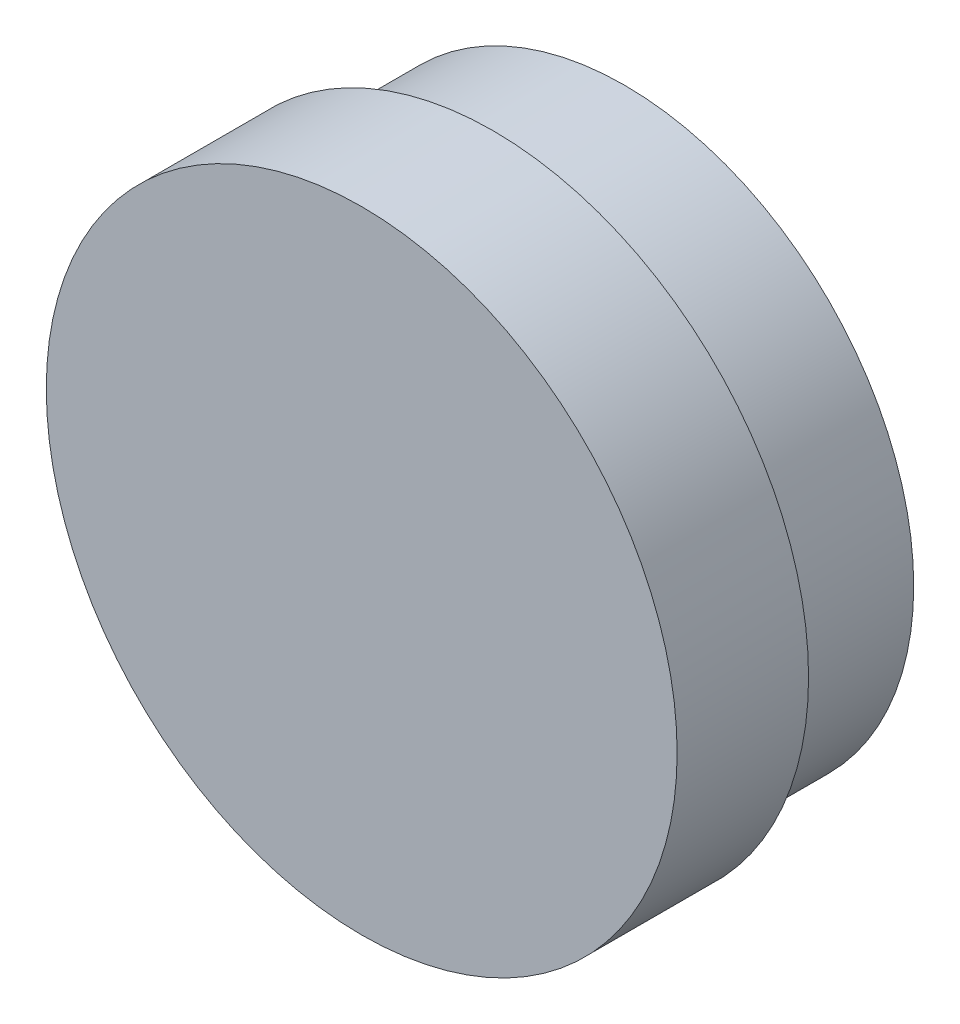
ISO-10303-21;
HEADER;
FILE_DESCRIPTION(('STEP AP214'),'2;1');
FILE_NAME('part.step','',(''),(''),'','','');
FILE_SCHEMA(('AUTOMOTIVE_DESIGN { 1 0 10303 214 1 1 1 1 }'));
ENDSEC;
DATA;
#1=APPLICATION_CONTEXT('core data for automotive mechanical design processes');
#2=APPLICATION_PROTOCOL_DEFINITION('international standard','automotive_design',2000,#1);
#3=PRODUCT_CONTEXT('',#1,'mechanical');
#4=PRODUCT('Part','Part','',(#3));
#5=PRODUCT_RELATED_PRODUCT_CATEGORY('part','',(#4));
#6=PRODUCT_DEFINITION_FORMATION('','',#4);
#7=PRODUCT_DEFINITION_CONTEXT('part definition',#1,'design');
#8=PRODUCT_DEFINITION('design','',#6,#7);
#9=PRODUCT_DEFINITION_SHAPE('','',#8);
#10=(LENGTH_UNIT() NAMED_UNIT(*) SI_UNIT(.MILLI.,.METRE.));
#11=(NAMED_UNIT(*) PLANE_ANGLE_UNIT() SI_UNIT($,.RADIAN.));
#12=(NAMED_UNIT(*) SI_UNIT($,.STERADIAN.) SOLID_ANGLE_UNIT());
#13=UNCERTAINTY_MEASURE_WITH_UNIT(LENGTH_MEASURE(1.E-05),#10,'distance_accuracy_value','');
#14=(GEOMETRIC_REPRESENTATION_CONTEXT(3) GLOBAL_UNCERTAINTY_ASSIGNED_CONTEXT((#13)) GLOBAL_UNIT_ASSIGNED_CONTEXT((#10,
#11,#12)) REPRESENTATION_CONTEXT('',''));
#15=CARTESIAN_POINT('',(0.,0.,0.));
#16=DIRECTION('',(0.,0.,1.));
#17=DIRECTION('',(1.,0.,0.));
#18=AXIS2_PLACEMENT_3D('',#15,#16,#17);
#19=CARTESIAN_POINT('',(1.85019794140934,28.1046296296296,11.9999999999998));
#20=DIRECTION('',(0.,0.,-1.));
#21=DIRECTION('',(-1.,0.,0.));
#22=AXIS2_PLACEMENT_3D('',#19,#20,#21);
#23=CYLINDRICAL_SURFACE('',#22,12.);
#24=CARTESIAN_POINT('',(1.85019794140934,28.1046296296296,16.9999999999998));
#25=DIRECTION('',(0.,0.,1.));
#26=DIRECTION('',(1.,0.,0.));
#27=AXIS2_PLACEMENT_3D('',#24,#25,#26);
#28=CIRCLE('',#27,12.);
#29=CARTESIAN_POINT('',(13.8501979414093,28.1046296296296,16.9999999999998));
#30=VERTEX_POINT('',#29);
#31=EDGE_CURVE('E57',#30,#30,#28,.F.);
#32=ORIENTED_EDGE('',*,*,#31,.F.);
#33=EDGE_LOOP('',(#32));
#34=FACE_BOUND('',#33,.T.);
#35=CARTESIAN_POINT('',(1.85019794140934,28.1046296296296,21.9999999999998));
#36=DIRECTION('',(0.,0.,1.));
#37=DIRECTION('',(1.,0.,0.));
#38=AXIS2_PLACEMENT_3D('',#35,#36,#37);
#39=CIRCLE('',#38,12.);
#40=CARTESIAN_POINT('',(13.8501979414093,28.1046296296296,21.9999999999998));
#41=VERTEX_POINT('',#40);
#42=EDGE_CURVE('E12',#41,#41,#39,.T.);
#43=ORIENTED_EDGE('',*,*,#42,.F.);
#44=EDGE_LOOP('',(#43));
#45=FACE_BOUND('',#44,.T.);
#46=ADVANCED_FACE('F40',(#34,#45),#23,.T.);
#47=CARTESIAN_POINT('',(1.85019794140934,28.1046296296296,21.9999999999998));
#48=DIRECTION('',(0.,0.,1.));
#49=DIRECTION('',(1.,0.,0.));
#50=AXIS2_PLACEMENT_3D('',#47,#48,#49);
#51=PLANE('',#50);
#52=ORIENTED_EDGE('',*,*,#42,.T.);
#53=EDGE_LOOP('',(#52));
#54=FACE_BOUND('',#53,.T.);
#55=ADVANCED_FACE('F69',(#54),#51,.T.);
#56=CARTESIAN_POINT('',(1.85019794140934,28.1046296296296,55.9411254969541));
#57=DIRECTION('',(0.,0.,-1.));
#58=DIRECTION('',(-1.,0.,0.));
#59=AXIS2_PLACEMENT_3D('',#56,#57,#58);
#60=CYLINDRICAL_SURFACE('',#59,11.);
#61=CARTESIAN_POINT('',(1.85019794140934,28.1046296296296,16.9999999999998));
#62=DIRECTION('',(0.,0.,1.));
#63=DIRECTION('',(1.,0.,0.));
#64=AXIS2_PLACEMENT_3D('',#61,#62,#63);
#65=CIRCLE('',#64,11.);
#66=CARTESIAN_POINT('',(-9.14980205859066,28.1046296296296,16.9999999999998));
#67=VERTEX_POINT('',#66);
#68=EDGE_CURVE('E52',#67,#67,#65,.F.);
#69=CARTESIAN_POINT('',(1.85019794140934,28.1046296296296,11.9999999999998));
#70=DIRECTION('',(0.,0.,1.));
#71=DIRECTION('',(1.,0.,0.));
#72=AXIS2_PLACEMENT_3D('',#69,#70,#71);
#73=CIRCLE('',#72,11.);
#74=CARTESIAN_POINT('',(-9.14980205859066,28.1046296296296,11.9999999999998));
#75=VERTEX_POINT('',#74);
#76=EDGE_CURVE('E47',#75,#75,#73,.T.);
#77=CARTESIAN_POINT('',(-9.14980205859066,28.1046296296296,16.9999999999998));
#78=CARTESIAN_POINT('',(-9.14980205859066,28.1046296296296,16.9479166666665));
#79=CARTESIAN_POINT('',(-9.14980205859066,28.1046296296296,16.8958333333331));
#80=CARTESIAN_POINT('',(-9.14980205859066,28.1046296296296,16.7916666666665));
#81=CARTESIAN_POINT('',(-9.14980205859066,28.1046296296296,16.7395833333331));
#82=CARTESIAN_POINT('',(-9.14980205859066,28.1046296296296,16.6354166666665));
#83=CARTESIAN_POINT('',(-9.14980205859066,28.1046296296296,16.5833333333331));
#84=CARTESIAN_POINT('',(-9.14980205859066,28.1046296296296,16.4791666666665));
#85=CARTESIAN_POINT('',(-9.14980205859066,28.1046296296296,16.4270833333331));
#86=CARTESIAN_POINT('',(-9.14980205859066,28.1046296296296,16.3229166666665));
#87=CARTESIAN_POINT('',(-9.14980205859066,28.1046296296296,16.2708333333331));
#88=CARTESIAN_POINT('',(-9.14980205859066,28.1046296296296,16.1666666666665));
#89=CARTESIAN_POINT('',(-9.14980205859066,28.1046296296296,16.1145833333331));
#90=CARTESIAN_POINT('',(-9.14980205859066,28.1046296296296,16.0104166666665));
#91=CARTESIAN_POINT('',(-9.14980205859066,28.1046296296296,15.9583333333331));
#92=CARTESIAN_POINT('',(-9.14980205859066,28.1046296296296,15.8541666666665));
#93=CARTESIAN_POINT('',(-9.14980205859066,28.1046296296296,15.8020833333331));
#94=CARTESIAN_POINT('',(-9.14980205859066,28.1046296296296,15.6979166666665));
#95=CARTESIAN_POINT('',(-9.14980205859066,28.1046296296296,15.6458333333331));
#96=CARTESIAN_POINT('',(-9.14980205859066,28.1046296296296,15.5416666666665));
#97=CARTESIAN_POINT('',(-9.14980205859066,28.1046296296296,15.4895833333331));
#98=CARTESIAN_POINT('',(-9.14980205859066,28.1046296296296,15.3854166666665));
#99=CARTESIAN_POINT('',(-9.14980205859066,28.1046296296296,15.3333333333331));
#100=CARTESIAN_POINT('',(-9.14980205859066,28.1046296296296,15.2291666666665));
#101=CARTESIAN_POINT('',(-9.14980205859066,28.1046296296296,15.1770833333331));
#102=CARTESIAN_POINT('',(-9.14980205859066,28.1046296296296,15.0729166666665));
#103=CARTESIAN_POINT('',(-9.14980205859066,28.1046296296296,15.0208333333331));
#104=CARTESIAN_POINT('',(-9.14980205859066,28.1046296296296,14.9166666666665));
#105=CARTESIAN_POINT('',(-9.14980205859066,28.1046296296296,14.8645833333331));
#106=CARTESIAN_POINT('',(-9.14980205859066,28.1046296296296,14.7604166666665));
#107=CARTESIAN_POINT('',(-9.14980205859066,28.1046296296296,14.7083333333331));
#108=CARTESIAN_POINT('',(-9.14980205859066,28.1046296296296,14.6041666666665));
#109=CARTESIAN_POINT('',(-9.14980205859066,28.1046296296296,14.5520833333331));
#110=CARTESIAN_POINT('',(-9.14980205859066,28.1046296296296,14.4479166666665));
#111=CARTESIAN_POINT('',(-9.14980205859066,28.1046296296296,14.3958333333331));
#112=CARTESIAN_POINT('',(-9.14980205859066,28.1046296296296,14.2916666666665));
#113=CARTESIAN_POINT('',(-9.14980205859066,28.1046296296296,14.2395833333331));
#114=CARTESIAN_POINT('',(-9.14980205859066,28.1046296296296,14.1354166666665));
#115=CARTESIAN_POINT('',(-9.14980205859066,28.1046296296296,14.0833333333331));
#116=CARTESIAN_POINT('',(-9.14980205859066,28.1046296296296,13.9791666666665));
#117=CARTESIAN_POINT('',(-9.14980205859066,28.1046296296296,13.9270833333331));
#118=CARTESIAN_POINT('',(-9.14980205859066,28.1046296296296,13.8229166666665));
#119=CARTESIAN_POINT('',(-9.14980205859066,28.1046296296296,13.7708333333331));
#120=CARTESIAN_POINT('',(-9.14980205859066,28.1046296296296,13.6666666666665));
#121=CARTESIAN_POINT('',(-9.14980205859066,28.1046296296296,13.6145833333331));
#122=CARTESIAN_POINT('',(-9.14980205859066,28.1046296296296,13.5104166666665));
#123=CARTESIAN_POINT('',(-9.14980205859066,28.1046296296296,13.4583333333331));
#124=CARTESIAN_POINT('',(-9.14980205859066,28.1046296296296,13.3541666666665));
#125=CARTESIAN_POINT('',(-9.14980205859066,28.1046296296296,13.3020833333331));
#126=CARTESIAN_POINT('',(-9.14980205859066,28.1046296296296,13.1979166666665));
#127=CARTESIAN_POINT('',(-9.14980205859066,28.1046296296296,13.1458333333331));
#128=CARTESIAN_POINT('',(-9.14980205859066,28.1046296296296,13.0416666666665));
#129=CARTESIAN_POINT('',(-9.14980205859066,28.1046296296296,12.9895833333331));
#130=CARTESIAN_POINT('',(-9.14980205859066,28.1046296296296,12.8854166666665));
#131=CARTESIAN_POINT('',(-9.14980205859066,28.1046296296296,12.8333333333331));
#132=CARTESIAN_POINT('',(-9.14980205859066,28.1046296296296,12.7291666666665));
#133=CARTESIAN_POINT('',(-9.14980205859066,28.1046296296296,12.6770833333331));
#134=CARTESIAN_POINT('',(-9.14980205859066,28.1046296296296,12.5729166666665));
#135=CARTESIAN_POINT('',(-9.14980205859066,28.1046296296296,12.5208333333331));
#136=CARTESIAN_POINT('',(-9.14980205859066,28.1046296296296,12.4166666666665));
#137=CARTESIAN_POINT('',(-9.14980205859066,28.1046296296296,12.3645833333331));
#138=CARTESIAN_POINT('',(-9.14980205859066,28.1046296296296,12.2604166666665));
#139=CARTESIAN_POINT('',(-9.14980205859066,28.1046296296296,12.2083333333331));
#140=CARTESIAN_POINT('',(-9.14980205859066,28.1046296296296,12.1041666666665));
#141=CARTESIAN_POINT('',(-9.14980205859066,28.1046296296296,12.0520833333331));
#142=CARTESIAN_POINT('',(-9.14980205859066,28.1046296296296,11.9999999999998));
#143=B_SPLINE_CURVE_WITH_KNOTS('',3,(#77,#78,#79,#80,#81,#82,#83,#84,#85,#86,#87,#88,#89,#90,
#91,#92,#93,#94,#95,#96,#97,#98,#99,#100,#101,#102,#103,#104,#105,#106,#107,#108,#109,#110,#111,
#112,#113,#114,#115,#116,#117,#118,#119,#120,#121,#122,#123,#124,#125,#126,#127,#128,#129,#130,
#131,#132,#133,#134,#135,#136,#137,#138,#139,#140,#141,#142),.UNSPECIFIED.,.F.,.F.,(4,2,2,2,2,2,
2,2,2,2,2,2,2,2,2,2,2,2,2,2,2,2,2,2,2,2,2,2,2,2,2,2,4),(0.,0.156249999999997,0.3125,
0.468749999999997,0.625000000000001,0.781249999999997,0.937500000000001,1.09375,1.25,1.40625,
1.56249999999999,1.71875,1.87499999999999,2.03125,2.1875,2.34375,2.5,2.65624999999999,2.8125,
2.96874999999999,3.125,3.28124999999999,3.4375,3.59374999999999,3.74999999999999,
3.90624999999999,4.06249999999999,4.21874999999999,4.37499999999999,4.53124999999999,
4.68749999999999,4.84374999999999,4.99999999999999),.UNSPECIFIED.);
#144=EDGE_CURVE('BSEAM73',#67,#75,#143,.T.);
#145=ORIENTED_EDGE('',*,*,#68,.T.);
#146=ORIENTED_EDGE('',*,*,#76,.T.);
#147=ORIENTED_EDGE('',*,*,#144,.T.);
#148=ORIENTED_EDGE('',*,*,#144,.F.);
#149=EDGE_LOOP('',(#145,#147,#146,#148));
#150=FACE_BOUND('',#149,.T.);
#151=ADVANCED_FACE('F73',(#150),#60,.T.);
#152=CARTESIAN_POINT('',(1.85019794140934,28.1046296296296,16.9999999999998));
#153=DIRECTION('',(0.,0.,1.));
#154=DIRECTION('',(1.,0.,0.));
#155=AXIS2_PLACEMENT_3D('',#152,#153,#154);
#156=PLANE('',#155);
#157=ORIENTED_EDGE('',*,*,#31,.T.);
#158=EDGE_LOOP('',(#157));
#159=FACE_BOUND('',#158,.T.);
#160=ORIENTED_EDGE('',*,*,#68,.F.);
#161=EDGE_LOOP('',(#160));
#162=FACE_BOUND('',#161,.T.);
#163=ADVANCED_FACE('F64',(#159,#162),#156,.F.);
#164=CARTESIAN_POINT('',(1.85019794140934,28.1046296296296,11.9999999999998));
#165=DIRECTION('',(0.,0.,1.));
#166=DIRECTION('',(1.,0.,0.));
#167=AXIS2_PLACEMENT_3D('',#164,#165,#166);
#168=PLANE('',#167);
#169=ORIENTED_EDGE('',*,*,#76,.F.);
#170=EDGE_LOOP('',(#169));
#171=FACE_BOUND('',#170,.T.);
#172=ADVANCED_FACE('F81',(#171),#168,.F.);
#173=CLOSED_SHELL('',(#46,#55,#151,#163,#172));
#174=MANIFOLD_SOLID_BREP('B2',#173);
#175=ADVANCED_BREP_SHAPE_REPRESENTATION('',(#18,#174),#14);
#176=SHAPE_DEFINITION_REPRESENTATION(#9,#175);
ENDSEC;
END-ISO-10303-21;
